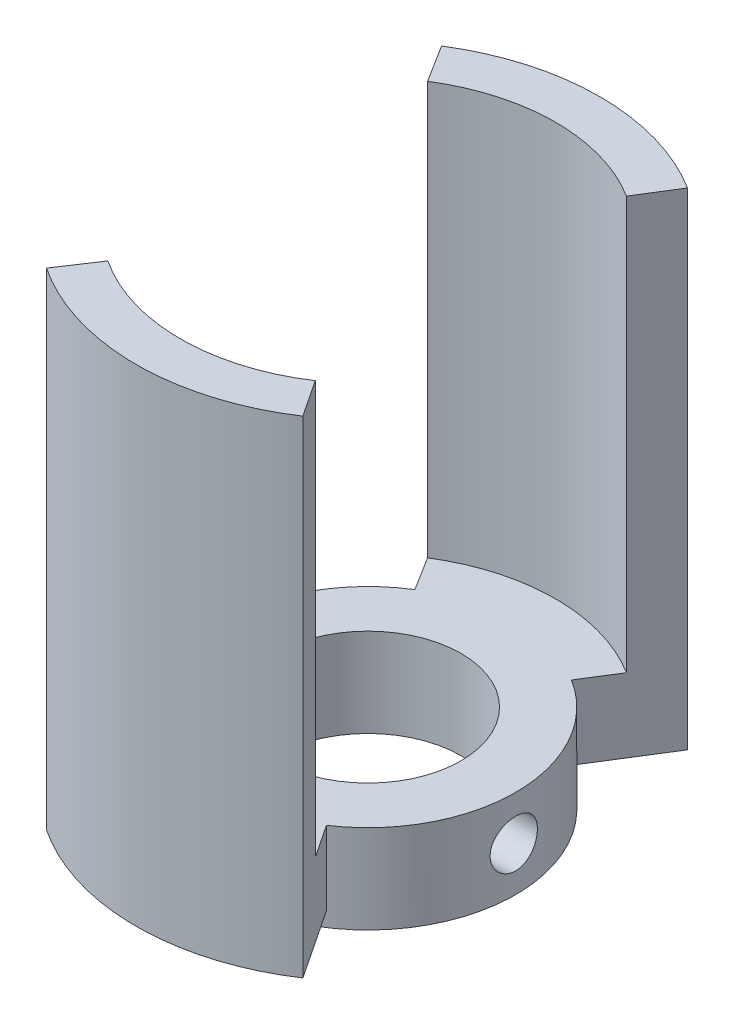
ISO-10303-21;
HEADER;
FILE_DESCRIPTION(('STEP AP214'),'2;1');
FILE_NAME('part.step','',(''),(''),'','','');
FILE_SCHEMA(('AUTOMOTIVE_DESIGN { 1 0 10303 214 1 1 1 1 }'));
ENDSEC;
DATA;
#1=APPLICATION_CONTEXT('core data for automotive mechanical design processes');
#2=APPLICATION_PROTOCOL_DEFINITION('international standard','automotive_design',2000,#1);
#3=PRODUCT_CONTEXT('',#1,'mechanical');
#4=PRODUCT('Part','Part','',(#3));
#5=PRODUCT_RELATED_PRODUCT_CATEGORY('part','',(#4));
#6=PRODUCT_DEFINITION_FORMATION('','',#4);
#7=PRODUCT_DEFINITION_CONTEXT('part definition',#1,'design');
#8=PRODUCT_DEFINITION('design','',#6,#7);
#9=PRODUCT_DEFINITION_SHAPE('','',#8);
#10=(LENGTH_UNIT() NAMED_UNIT(*) SI_UNIT(.MILLI.,.METRE.));
#11=(NAMED_UNIT(*) PLANE_ANGLE_UNIT() SI_UNIT($,.RADIAN.));
#12=(NAMED_UNIT(*) SI_UNIT($,.STERADIAN.) SOLID_ANGLE_UNIT());
#13=UNCERTAINTY_MEASURE_WITH_UNIT(LENGTH_MEASURE(1.E-05),#10,'distance_accuracy_value','');
#14=(GEOMETRIC_REPRESENTATION_CONTEXT(3) GLOBAL_UNCERTAINTY_ASSIGNED_CONTEXT((#13)) GLOBAL_UNIT_ASSIGNED_CONTEXT((#10,
#11,#12)) REPRESENTATION_CONTEXT('',''));
#15=CARTESIAN_POINT('',(0.,0.,0.));
#16=DIRECTION('',(0.,0.,1.));
#17=DIRECTION('',(1.,0.,0.));
#18=AXIS2_PLACEMENT_3D('',#15,#16,#17);
#19=CARTESIAN_POINT('',(-5.,0.,0.));
#20=DIRECTION('',(0.,1.,0.));
#21=DIRECTION('',(0.,0.,1.));
#22=AXIS2_PLACEMENT_3D('',#19,#20,#21);
#23=PLANE('',#22);
#24=CARTESIAN_POINT('',(0.,0.,0.));
#25=DIRECTION('',(0.,1.,0.));
#26=DIRECTION('',(0.,0.,1.));
#27=AXIS2_PLACEMENT_3D('',#24,#25,#26);
#28=CIRCLE('',#27,3.15);
#29=CARTESIAN_POINT('',(0.,0.,3.15));
#30=VERTEX_POINT('',#29);
#31=EDGE_CURVE('E291',#30,#30,#28,.T.);
#32=ORIENTED_EDGE('',*,*,#31,.F.);
#33=EDGE_LOOP('',(#32));
#34=FACE_BOUND('',#33,.T.);
#35=DIRECTION('',(0.55269750220772,0.,-0.833381947880651));
#36=VECTOR('',#35,1.);
#37=CARTESIAN_POINT('',(-4.33867539233068,0.,6.54204829086304));
#38=LINE('',#37,#36);
#39=CARTESIAN_POINT('',(-3.5096291390191,0.,5.29197536904208));
#40=VERTEX_POINT('',#39);
#41=CARTESIAN_POINT('',(-2.76348751103868,0.,4.1669097394032));
#42=VERTEX_POINT('',#41);
#43=EDGE_CURVE('E161',#40,#42,#38,.T.);
#44=ORIENTED_EDGE('',*,*,#43,.F.);
#45=CARTESIAN_POINT('',(0.,0.,0.));
#46=DIRECTION('',(0.,-1.,0.));
#47=DIRECTION('',(0.,0.,1.));
#48=AXIS2_PLACEMENT_3D('',#45,#46,#47);
#49=CIRCLE('',#48,6.35);
#50=CARTESIAN_POINT('',(3.50962913901908,0.,5.29197536904209));
#51=VERTEX_POINT('',#50);
#52=EDGE_CURVE('E151',#51,#40,#49,.T.);
#53=ORIENTED_EDGE('',*,*,#52,.F.);
#54=DIRECTION('',(0.55269750220773,0.,0.833381947880644));
#55=VECTOR('',#54,1.);
#56=CARTESIAN_POINT('',(2.76348751103865,0.,4.16690973940323));
#57=LINE('',#56,#55);
#58=CARTESIAN_POINT('',(2.76348751103864,0.,4.16690973940322));
#59=VERTEX_POINT('',#58);
#60=EDGE_CURVE('E51',#59,#51,#57,.T.);
#61=ORIENTED_EDGE('',*,*,#60,.F.);
#62=CARTESIAN_POINT('',(0.,0.,0.));
#63=DIRECTION('',(0.,1.,0.));
#64=DIRECTION('',(0.,0.,1.));
#65=AXIS2_PLACEMENT_3D('',#62,#63,#64);
#66=CIRCLE('',#65,5.);
#67=CARTESIAN_POINT('',(2.65064923820455,0.,-4.23958236339449));
#68=VERTEX_POINT('',#67);
#69=EDGE_CURVE('E302',#59,#68,#66,.T.);
#70=ORIENTED_EDGE('',*,*,#69,.T.);
#71=DIRECTION('',(-0.53012984764091,0.,0.847916472678899));
#72=VECTOR('',#71,1.);
#73=CARTESIAN_POINT('',(4.16151930398115,0.,-6.65614431052935));
#74=LINE('',#73,#72);
#75=CARTESIAN_POINT('',(3.36632453251978,0.,-5.38426960151101));
#76=VERTEX_POINT('',#75);
#77=EDGE_CURVE('E193',#76,#68,#74,.T.);
#78=ORIENTED_EDGE('',*,*,#77,.F.);
#79=CARTESIAN_POINT('',(0.,0.,0.));
#80=DIRECTION('',(0.,-1.,0.));
#81=DIRECTION('',(0.,0.,1.));
#82=AXIS2_PLACEMENT_3D('',#79,#80,#81);
#83=CIRCLE('',#82,6.35);
#84=CARTESIAN_POINT('',(-3.36632453251978,0.,-5.38426960151101));
#85=VERTEX_POINT('',#84);
#86=EDGE_CURVE('E58',#85,#76,#83,.T.);
#87=ORIENTED_EDGE('',*,*,#86,.F.);
#88=DIRECTION('',(-0.53012984764091,0.,-0.847916472678899));
#89=VECTOR('',#88,1.);
#90=CARTESIAN_POINT('',(-2.65064923820455,0.,-4.23958236339449));
#91=LINE('',#90,#89);
#92=CARTESIAN_POINT('',(-2.65064923820455,0.,-4.23958236339449));
#93=VERTEX_POINT('',#92);
#94=EDGE_CURVE('E198',#93,#85,#91,.T.);
#95=ORIENTED_EDGE('',*,*,#94,.F.);
#96=EDGE_CURVE('E44',#93,#42,#66,.T.);
#97=ORIENTED_EDGE('',*,*,#96,.T.);
#98=EDGE_LOOP('',(#44,#53,#61,#70,#78,#87,#95,#97));
#99=FACE_BOUND('',#98,.T.);
#100=ADVANCED_FACE('F37',(#34,#99),#23,.T.);
#101=CARTESIAN_POINT('',(0.,5.88818210542641,0.));
#102=DIRECTION('',(0.,1.,0.));
#103=DIRECTION('',(0.,0.,1.));
#104=AXIS2_PLACEMENT_3D('',#101,#102,#103);
#105=CYLINDRICAL_SURFACE('',#104,5.);
#106=CARTESIAN_POINT('',(4.93558507170123,-1.5,-0.799999999999994));
#107=CARTESIAN_POINT('',(4.93558585473547,-1.4553733138568,-0.799998185073409));
#108=CARTESIAN_POINT('',(4.93619688733532,-1.41072162366317,-0.796253222084032));
#109=CARTESIAN_POINT('',(4.93857300521684,-1.32266926107482,-0.781377782006159));
#110=CARTESIAN_POINT('',(4.94033918004371,-1.27926981020067,-0.770240332080269));
#111=CARTESIAN_POINT('',(4.94482054000624,-1.19500907475503,-0.740923891747522));
#112=CARTESIAN_POINT('',(4.94753495860065,-1.1541457713407,-0.72275058770329));
#113=CARTESIAN_POINT('',(4.95360605163724,-1.07605340784582,-0.679892166593979));
#114=CARTESIAN_POINT('',(4.95696264715696,-1.03882390202597,-0.655207849580235));
#115=CARTESIAN_POINT('',(4.96397400342678,-0.968712426881564,-0.599788560945842));
#116=CARTESIAN_POINT('',(4.96763096787548,-0.935868293795989,-0.569005994830315));
#117=CARTESIAN_POINT('',(4.97481140064582,-0.875788216136039,-0.502366839260941));
#118=CARTESIAN_POINT('',(4.97833486128557,-0.848552593879727,-0.466509958388676));
#119=CARTESIAN_POINT('',(4.98487450432198,-0.800321615483304,-0.390495966811719));
#120=CARTESIAN_POINT('',(4.98788779685136,-0.779361323864757,-0.350316337789534));
#121=CARTESIAN_POINT('',(4.99304311049062,-0.744501224376021,-0.266950398356383));
#122=CARTESIAN_POINT('',(4.99518518385959,-0.730600993003736,-0.223764268468985));
#123=CARTESIAN_POINT('',(4.99834115266823,-0.710370902255032,-0.136001651578425));
#124=CARTESIAN_POINT('',(4.99936450470397,-0.703977552237963,-0.0914401453437619));
#125=CARTESIAN_POINT('',(5.00020018470641,-0.698745396765724,-0.0018659230089008));
#126=CARTESIAN_POINT('',(5.00001258881248,-0.699906116342033,0.0431467645452038));
#127=CARTESIAN_POINT('',(4.99845502458808,-0.709699394274016,0.131911886391411));
#128=CARTESIAN_POINT('',(4.99709586763407,-0.718263633698933,0.175672074928564));
#129=CARTESIAN_POINT('',(4.99335994390295,-0.742513405849864,0.261126137099067));
#130=CARTESIAN_POINT('',(4.99098314806818,-0.758199141923771,0.30281995169127));
#131=CARTESIAN_POINT('',(4.98546052013802,-0.796315383480049,0.383162394563613));
#132=CARTESIAN_POINT('',(4.98231146029854,-0.81877429095833,0.421797317397531));
#133=CARTESIAN_POINT('',(4.97559462459779,-0.869778571446803,0.494775868628128));
#134=CARTESIAN_POINT('',(4.97202681745693,-0.898324399268316,0.529119176053382));
#135=CARTESIAN_POINT('',(4.96482262808635,-0.961071825424101,0.592942886294138));
#136=CARTESIAN_POINT('',(4.96118592518751,-0.995333110336364,0.622364603286394));
#137=CARTESIAN_POINT('',(4.95429255402911,-1.06833710250877,0.675050723309758));
#138=CARTESIAN_POINT('',(4.95103588876406,-1.10707984507577,0.69831507782578));
#139=CARTESIAN_POINT('',(4.94527126199405,-1.18801220398281,0.738036126509164));
#140=CARTESIAN_POINT('',(4.94276403130194,-1.23020513406254,0.754486181687668));
#141=CARTESIAN_POINT('',(4.93879457567579,-1.31680424865733,0.780049416047773));
#142=CARTESIAN_POINT('',(4.93733226635919,-1.36121025414573,0.789163187678036));
#143=CARTESIAN_POINT('',(4.93563441966908,-1.45045112906939,0.799713399990509));
#144=CARTESIAN_POINT('',(4.9353855460576,-1.49527588587375,0.801233305499676));
#145=CARTESIAN_POINT('',(4.93610727492225,-1.58453958650626,0.796774670192975));
#146=CARTESIAN_POINT('',(4.93707783413686,-1.628978543965,0.790796395388179));
#147=CARTESIAN_POINT('',(4.94011677879918,-1.71594676217776,0.771582110819437));
#148=CARTESIAN_POINT('',(4.94217879200386,-1.75848556927231,0.758388213376957));
#149=CARTESIAN_POINT('',(4.94716299895284,-1.84074815480667,0.725161227645418));
#150=CARTESIAN_POINT('',(4.95008524049443,-1.88047177667274,0.705127759316014));
#151=CARTESIAN_POINT('',(4.95649180721203,-1.95634895723258,0.658591860869643));
#152=CARTESIAN_POINT('',(4.95998071331545,-1.99246918142802,0.632035720375417));
#153=CARTESIAN_POINT('',(4.96711393660611,-2.05977042425469,0.573282416990775));
#154=CARTESIAN_POINT('',(4.97075826382481,-2.09095112345601,0.541084889565661));
#155=CARTESIAN_POINT('',(4.97783368328296,-2.14779091683714,0.471593901952483));
#156=CARTESIAN_POINT('',(4.98126240933245,-2.17339449164431,0.434254752917194));
#157=CARTESIAN_POINT('',(4.98748283986874,-2.21796521839539,0.35575673895542));
#158=CARTESIAN_POINT('',(4.9902745636858,-2.23693257172911,0.314597989990528));
#159=CARTESIAN_POINT('',(4.99489611998972,-2.26760508960747,0.229797510837734));
#160=CARTESIAN_POINT('',(4.99672986677083,-2.27933984249439,0.186166705239429));
#161=CARTESIAN_POINT('',(4.99924535633416,-2.295309534557,0.0975221020879297));
#162=CARTESIAN_POINT('',(4.99992718616821,-2.2995450404616,0.0525084093030925));
#163=CARTESIAN_POINT('',(5.00006093539052,-2.3003807192317,-0.0370872642982859));
#164=CARTESIAN_POINT('',(4.9995264932218,-2.29706555976115,-0.0816684579131941));
#165=CARTESIAN_POINT('',(4.99731544898762,-2.28307646469126,-0.169630532454884));
#166=CARTESIAN_POINT('',(4.99563885213226,-2.27240256265979,-0.213011418856085));
#167=CARTESIAN_POINT('',(4.9913311157785,-2.24403047006883,-0.297312849245192));
#168=CARTESIAN_POINT('',(4.98870088038931,-2.22633893118065,-0.338235680929927));
#169=CARTESIAN_POINT('',(4.98277371983535,-2.18444301584854,-0.416545279322136));
#170=CARTESIAN_POINT('',(4.9794767671163,-2.16023837021556,-0.453931899790391));
#171=CARTESIAN_POINT('',(4.9725381855774,-2.1057006718458,-0.524535556587544));
#172=CARTESIAN_POINT('',(4.96889327467274,-2.07530539880372,-0.557704213276182));
#173=CARTESIAN_POINT('',(4.96169293810507,-2.0093800524562,-0.618500476330203));
#174=CARTESIAN_POINT('',(4.95813753360885,-1.97384877771776,-0.646126782587249));
#175=CARTESIAN_POINT('',(4.95149402021015,-1.89838833042705,-0.695216766947152));
#176=CARTESIAN_POINT('',(4.94840907975937,-1.85843221987585,-0.716639464440317));
#177=CARTESIAN_POINT('',(4.94309308858453,-1.7754566841129,-0.752436729569794));
#178=CARTESIAN_POINT('',(4.94086117163203,-1.73244041937774,-0.766818451370858));
#179=CARTESIAN_POINT('',(4.93800748018891,-1.65770481675488,-0.784943942649531));
#180=CARTESIAN_POINT('',(4.93710403046998,-1.62644188261262,-0.790581080454425));
#181=CARTESIAN_POINT('',(4.93589255254275,-1.56345684217454,-0.798109724682122));
#182=CARTESIAN_POINT('',(4.93558451487318,-1.53173474318303,-0.800001290623028));
#183=CARTESIAN_POINT('',(4.93558507170123,-1.5,-0.799999999999994));
#184=B_SPLINE_CURVE_WITH_KNOTS('',3,(#106,#107,#108,#109,#110,#111,#112,#113,#114,#115,#116,
#117,#118,#119,#120,#121,#122,#123,#124,#125,#126,#127,#128,#129,#130,#131,#132,#133,#134,#135,
#136,#137,#138,#139,#140,#141,#142,#143,#144,#145,#146,#147,#148,#149,#150,#151,#152,#153,#154,
#155,#156,#157,#158,#159,#160,#161,#162,#163,#164,#165,#166,#167,#168,#169,#170,#171,#172,#173,
#174,#175,#176,#177,#178,#179,#180,#181,#182,#183),.UNSPECIFIED.,.T.,.F.,(4,2,2,2,2,2,2,2,2,2,2,
2,2,2,2,2,2,2,2,2,2,2,2,2,2,2,2,2,2,2,2,2,2,2,2,2,2,2,4),(0.,0.133764032978236,
0.267654416240314,0.401436814708976,0.535202782098974,0.670057077330418,0.804919120403261,
0.940521238000373,1.07611522045935,1.21055394043863,1.34498420755127,1.47818704938262,
1.61139369493981,1.74516687269945,1.87895004942163,2.01422953733833,2.14951009111739,
2.28492213686846,2.42032324619165,2.5542328253214,2.68813765390883,2.82126919083115,
2.95440812640359,3.08868247170644,3.22296549674046,3.35852970160141,3.49408979213058,
3.62909156425648,3.7640831336681,3.89756846817798,4.03105319378105,4.16441169698708,
4.29777571279491,4.4325528842427,4.56736163445242,4.70304160363668,4.83858342408623,
4.93370665764443,5.02882837965776),.UNSPECIFIED.);
#185=CARTESIAN_POINT('',(4.93558507170123,-1.5,-0.799999999999994));
#186=VERTEX_POINT('',#185);
#187=EDGE_CURVE('E224',#186,#186,#184,.T.);
#188=ORIENTED_EDGE('',*,*,#187,.F.);
#189=EDGE_LOOP('',(#188));
#190=FACE_BOUND('',#189,.T.);
#191=CARTESIAN_POINT('',(0.,-3.,0.));
#192=DIRECTION('',(0.,1.,0.));
#193=DIRECTION('',(0.,0.,1.));
#194=AXIS2_PLACEMENT_3D('',#191,#192,#193);
#195=CIRCLE('',#194,5.);
#196=CARTESIAN_POINT('',(0.,-3.,5.));
#197=VERTEX_POINT('',#196);
#198=EDGE_CURVE('E11',#197,#197,#195,.T.);
#199=ORIENTED_EDGE('',*,*,#198,.T.);
#200=EDGE_LOOP('',(#199));
#201=FACE_BOUND('',#200,.T.);
#202=CARTESIAN_POINT('',(0.,-2.5,0.));
#203=DIRECTION('',(0.,1.,0.));
#204=DIRECTION('',(0.,0.,-1.));
#205=AXIS2_PLACEMENT_3D('',#202,#203,#204);
#206=CIRCLE('',#205,5.);
#207=CARTESIAN_POINT('',(-2.76348751103868,-2.5,4.1669097394032));
#208=VERTEX_POINT('',#207);
#209=CARTESIAN_POINT('',(2.76348751103865,-2.5,4.16690973940323));
#210=VERTEX_POINT('',#209);
#211=EDGE_CURVE('E165',#208,#210,#206,.T.);
#212=ORIENTED_EDGE('',*,*,#211,.F.);
#213=DIRECTION('',(0.,1.,0.));
#214=VECTOR('',#213,1.);
#215=CARTESIAN_POINT('',(-2.76348751103868,-2.5,4.1669097394032));
#216=LINE('',#215,#214);
#217=EDGE_CURVE('E171',#208,#42,#216,.T.);
#218=ORIENTED_EDGE('',*,*,#217,.T.);
#219=ORIENTED_EDGE('',*,*,#96,.F.);
#220=DIRECTION('',(0.,1.,0.));
#221=VECTOR('',#220,1.);
#222=CARTESIAN_POINT('',(-2.65064923820455,-2.5,-4.23958236339449));
#223=LINE('',#222,#221);
#224=CARTESIAN_POINT('',(-2.65064923820455,-2.5,-4.23958236339449));
#225=VERTEX_POINT('',#224);
#226=EDGE_CURVE('E209',#225,#93,#223,.T.);
#227=ORIENTED_EDGE('',*,*,#226,.F.);
#228=CARTESIAN_POINT('',(0.,-2.5,0.));
#229=DIRECTION('',(0.,1.,0.));
#230=DIRECTION('',(0.,0.,-1.));
#231=AXIS2_PLACEMENT_3D('',#228,#229,#230);
#232=CIRCLE('',#231,5.);
#233=CARTESIAN_POINT('',(2.65064923820455,-2.5,-4.23958236339449));
#234=VERTEX_POINT('',#233);
#235=EDGE_CURVE('E200',#234,#225,#232,.T.);
#236=ORIENTED_EDGE('',*,*,#235,.F.);
#237=DIRECTION('',(0.,1.,0.));
#238=VECTOR('',#237,1.);
#239=CARTESIAN_POINT('',(2.65064923820455,-2.5,-4.23958236339449));
#240=LINE('',#239,#238);
#241=EDGE_CURVE('E212',#234,#68,#240,.T.);
#242=ORIENTED_EDGE('',*,*,#241,.T.);
#243=ORIENTED_EDGE('',*,*,#69,.F.);
#244=DIRECTION('',(0.,1.,0.));
#245=VECTOR('',#244,1.);
#246=CARTESIAN_POINT('',(2.76348751103865,-2.5,4.16690973940323));
#247=LINE('',#246,#245);
#248=EDGE_CURVE('E136',#210,#59,#247,.T.);
#249=ORIENTED_EDGE('',*,*,#248,.F.);
#250=EDGE_LOOP('',(#212,#218,#219,#227,#236,#242,#243,#249));
#251=FACE_BOUND('',#250,.T.);
#252=ADVANCED_FACE('F282',(#190,#201,#251),#105,.T.);
#253=CARTESIAN_POINT('',(-5.,-3.,0.));
#254=DIRECTION('',(0.,-1.,0.));
#255=DIRECTION('',(0.,0.,-1.));
#256=AXIS2_PLACEMENT_3D('',#253,#254,#255);
#257=PLANE('',#256);
#258=CARTESIAN_POINT('',(0.,-3.,0.));
#259=DIRECTION('',(0.,1.,0.));
#260=DIRECTION('',(0.,0.,1.));
#261=AXIS2_PLACEMENT_3D('',#258,#259,#260);
#262=CIRCLE('',#261,3.15);
#263=CARTESIAN_POINT('',(0.,-3.,3.15));
#264=VERTEX_POINT('',#263);
#265=EDGE_CURVE('E305',#264,#264,#262,.T.);
#266=ORIENTED_EDGE('',*,*,#265,.T.);
#267=EDGE_LOOP('',(#266));
#268=FACE_BOUND('',#267,.T.);
#269=ORIENTED_EDGE('',*,*,#198,.F.);
#270=EDGE_LOOP('',(#269));
#271=FACE_BOUND('',#270,.T.);
#272=ADVANCED_FACE('F287',(#268,#271),#257,.T.);
#273=CARTESIAN_POINT('',(0.,-3.,0.));
#274=DIRECTION('',(0.,1.,0.));
#275=DIRECTION('',(0.,0.,1.));
#276=AXIS2_PLACEMENT_3D('',#273,#274,#275);
#277=CYLINDRICAL_SURFACE('',#276,3.15);
#278=CARTESIAN_POINT('',(3.04671954731643,-1.5,-0.799999999999994));
#279=CARTESIAN_POINT('',(3.04672037562088,-1.45584831992858,-0.799998787491232));
#280=CARTESIAN_POINT('',(3.04768977046248,-1.41168336372897,-0.796332478856327));
#281=CARTESIAN_POINT('',(3.05145231147786,-1.32462340259968,-0.781788518001451));
#282=CARTESIAN_POINT('',(3.05424648470091,-1.28172912707473,-0.770906804645788));
#283=CARTESIAN_POINT('',(3.06132217525296,-1.19848242249005,-0.742308305649663));
#284=CARTESIAN_POINT('',(3.06560173214644,-1.15812672548843,-0.724600525781015));
#285=CARTESIAN_POINT('',(3.07516353708976,-1.08095403317907,-0.682880169734236));
#286=CARTESIAN_POINT('',(3.08044583603438,-1.04413721763238,-0.658867273512338));
#287=CARTESIAN_POINT('',(3.09155223041649,-0.97425150673387,-0.604635833440505));
#288=CARTESIAN_POINT('',(3.09738520663052,-0.941274816388711,-0.574300264191975));
#289=CARTESIAN_POINT('',(3.10885877769155,-0.880818399137855,-0.508536568917144));
#290=CARTESIAN_POINT('',(3.11449935406675,-0.853339198806485,-0.473107955614191));
#291=CARTESIAN_POINT('',(3.12505103772182,-0.804278866130022,-0.397530396505204));
#292=CARTESIAN_POINT('',(3.12995044392561,-0.782788567223715,-0.357320712058883));
#293=CARTESIAN_POINT('',(3.13836630541931,-0.746907087038949,-0.273714256198096));
#294=CARTESIAN_POINT('',(3.1418829714787,-0.732514823730032,-0.230317971711088));
#295=CARTESIAN_POINT('',(3.14707433539005,-0.711534011221934,-0.142531701820605));
#296=CARTESIAN_POINT('',(3.14878595459454,-0.704788819636219,-0.0981813750153104));
#297=CARTESIAN_POINT('',(3.15030313322582,-0.698801666454749,-0.00894781846071554));
#298=CARTESIAN_POINT('',(3.150108983113,-0.699558561457948,0.0359353290393383));
#299=CARTESIAN_POINT('',(3.14786388222345,-0.708441982559227,0.123873150955545));
#300=CARTESIAN_POINT('',(3.14585554271486,-0.716399391953658,0.166946161605962));
#301=CARTESIAN_POINT('',(3.1402574919405,-0.739185804904947,0.251124305993878));
#302=CARTESIAN_POINT('',(3.13666769501371,-0.754015180690181,0.292229333000075));
#303=CARTESIAN_POINT('',(3.12824535898402,-0.79025971594598,0.371747015245165));
#304=CARTESIAN_POINT('',(3.12340162952679,-0.811734536565526,0.410131242711211));
#305=CARTESIAN_POINT('',(3.11299603080796,-0.860614990966019,0.482810089750206));
#306=CARTESIAN_POINT('',(3.107434033124,-0.888021685926844,0.517103975878619));
#307=CARTESIAN_POINT('',(3.09601405024654,-0.948892464417763,0.581637476849313));
#308=CARTESIAN_POINT('',(3.09015213668696,-0.982504269014047,0.611737212204872));
#309=CARTESIAN_POINT('',(3.07893459013064,-1.05435968543896,0.665904739897344));
#310=CARTESIAN_POINT('',(3.07357898238748,-1.09260352808812,0.689972231456058));
#311=CARTESIAN_POINT('',(3.06396595614438,-1.17291850349833,0.731485527959731));
#312=CARTESIAN_POINT('',(3.05971432517762,-1.21500830215592,0.748896653556091));
#313=CARTESIAN_POINT('',(3.05286429526141,-1.30165187295297,0.776351724296638));
#314=CARTESIAN_POINT('',(3.05026552965418,-1.34620509624175,0.786397303427492));
#315=CARTESIAN_POINT('',(3.04709270125328,-1.43521103325889,0.79860194445219));
#316=CARTESIAN_POINT('',(3.04646544638303,-1.47963346573185,0.800968254421254));
#317=CARTESIAN_POINT('',(3.04716169633487,-1.56823870789063,0.798315414932798));
#318=CARTESIAN_POINT('',(3.04848501516182,-1.61242154002013,0.793296969641834));
#319=CARTESIAN_POINT('',(3.05288224097786,-1.69851712971965,0.776199028048116));
#320=CARTESIAN_POINT('',(3.05592598509977,-1.74045571844924,0.764241102221881));
#321=CARTESIAN_POINT('',(3.06339227746886,-1.82173285910573,0.733738872080799));
#322=CARTESIAN_POINT('',(3.06781499303056,-1.86107109482206,0.715193768486928));
#323=CARTESIAN_POINT('',(3.07765223610146,-1.93690641571195,0.671612872592892));
#324=CARTESIAN_POINT('',(3.08308497232224,-1.97333017378177,0.646453685524546));
#325=CARTESIAN_POINT('',(3.09428588292921,-2.04151497878941,0.590514105694039));
#326=CARTESIAN_POINT('',(3.10005411416964,-2.07327523219913,0.559732758276661));
#327=CARTESIAN_POINT('',(3.1114570173882,-2.13207582550782,0.492469744445852));
#328=CARTESIAN_POINT('',(3.11708435475773,-2.15897252569249,0.455861030897153));
#329=CARTESIAN_POINT('',(3.12741700181015,-2.20623705219499,0.378526653870691));
#330=CARTESIAN_POINT('',(3.13212235994353,-2.22660522162627,0.337801206899975));
#331=CARTESIAN_POINT('',(3.14005099930513,-2.26005500980664,0.253672778818782));
#332=CARTESIAN_POINT('',(3.14328502472949,-2.27318960425132,0.210291921723112));
#333=CARTESIAN_POINT('',(3.14795371059435,-2.29195729751027,0.121845363558598));
#334=CARTESIAN_POINT('',(3.14938873017106,-2.29759189356591,0.0767800006187531));
#335=CARTESIAN_POINT('',(3.15028252080941,-2.30111317588415,-0.0124086801143127));
#336=CARTESIAN_POINT('',(3.1497952849568,-2.29921153611713,-0.0565232241986996));
#337=CARTESIAN_POINT('',(3.14701959516578,-2.28820070853938,-0.143782456005577));
#338=CARTESIAN_POINT('',(3.14473119796158,-2.27909174774974,-0.186927174232278));
#339=CARTESIAN_POINT('',(3.1386192227224,-2.25403986046255,-0.270792749677217));
#340=CARTESIAN_POINT('',(3.13480449671293,-2.23813630414253,-0.311526054708036));
#341=CARTESIAN_POINT('',(3.12604088416692,-2.19998221759256,-0.389769259415511));
#342=CARTESIAN_POINT('',(3.12109185072981,-2.17773086518824,-0.427278740719081));
#343=CARTESIAN_POINT('',(3.11044020828261,-2.12687332604076,-0.499009036121088));
#344=CARTESIAN_POINT('',(3.10472205617256,-2.09812427499131,-0.533126248782787));
#345=CARTESIAN_POINT('',(3.09324487456525,-2.03536329597628,-0.596123912464205));
#346=CARTESIAN_POINT('',(3.08748583499281,-2.00135002463133,-0.625003022672402));
#347=CARTESIAN_POINT('',(3.07645128983346,-1.92823121847673,-0.677256343279082));
#348=CARTESIAN_POINT('',(3.07118734386755,-1.88903963316484,-0.700512781076032));
#349=CARTESIAN_POINT('',(3.06189623834876,-1.80717457495404,-0.740072440308267));
#350=CARTESIAN_POINT('',(3.05786820031328,-1.76450360263631,-0.756380603791757));
#351=CARTESIAN_POINT('',(3.05211833149557,-1.68493838785163,-0.779220505535315));
#352=CARTESIAN_POINT('',(3.05010928406368,-1.64841690805514,-0.786995531950328));
#353=CARTESIAN_POINT('',(3.04740960233127,-1.57460006403489,-0.797385555480301));
#354=CARTESIAN_POINT('',(3.04671884746293,-1.53730477089763,-0.800001024476559));
#355=CARTESIAN_POINT('',(3.04671954731643,-1.5,-0.799999999999994));
#356=B_SPLINE_CURVE_WITH_KNOTS('',3,(#278,#279,#280,#281,#282,#283,#284,#285,#286,#287,#288,
#289,#290,#291,#292,#293,#294,#295,#296,#297,#298,#299,#300,#301,#302,#303,#304,#305,#306,#307,
#308,#309,#310,#311,#312,#313,#314,#315,#316,#317,#318,#319,#320,#321,#322,#323,#324,#325,#326,
#327,#328,#329,#330,#331,#332,#333,#334,#335,#336,#337,#338,#339,#340,#341,#342,#343,#344,#345,
#346,#347,#348,#349,#350,#351,#352,#353,#354,#355),.UNSPECIFIED.,.T.,.F.,(4,2,2,2,2,2,2,2,2,2,2,
2,2,2,2,2,2,2,2,2,2,2,2,2,2,2,2,2,2,2,2,2,2,2,2,2,2,2,4),(0.,0.132318004328744,
0.264710546128431,0.396929014210455,0.529154194917143,0.664087485925241,0.799033695269598,
0.935927228108652,1.07279988632832,1.20681510912295,1.34080990682816,1.47173703389584,
1.60267125361889,1.73481685320754,1.86698611248956,2.00284445787236,2.13870957604224,
2.27527319966463,2.41180651858235,2.54462302607884,2.67742686979991,2.80797153721006,
2.93853205014344,3.07172647474599,3.20494353711699,3.34161278102701,3.47827484097059,
3.61392226404176,3.74954260345277,3.88138108182068,4.01321540761625,4.14429598569532,
4.27539354920659,4.40971613795174,4.5440730612461,4.68103871106558,4.81790677903832,
4.9297155332035,5.04151406112203),.UNSPECIFIED.);
#357=CARTESIAN_POINT('',(3.04671954731643,-1.5,-0.799999999999994));
#358=VERTEX_POINT('',#357);
#359=EDGE_CURVE('E217',#358,#358,#356,.T.);
#360=ORIENTED_EDGE('',*,*,#359,.T.);
#361=EDGE_LOOP('',(#360));
#362=FACE_BOUND('',#361,.T.);
#363=ORIENTED_EDGE('',*,*,#265,.F.);
#364=EDGE_LOOP('',(#363));
#365=FACE_BOUND('',#364,.T.);
#366=ORIENTED_EDGE('',*,*,#31,.T.);
#367=EDGE_LOOP('',(#366));
#368=FACE_BOUND('',#367,.T.);
#369=ADVANCED_FACE('F236',(#362,#365,#368),#277,.F.);
#370=CARTESIAN_POINT('',(5.,-1.5,0.));
#371=DIRECTION('',(1.,0.,0.));
#372=DIRECTION('',(0.,0.,-1.));
#373=AXIS2_PLACEMENT_3D('',#370,#371,#372);
#374=CYLINDRICAL_SURFACE('',#373,0.799999999999994);
#375=ORIENTED_EDGE('',*,*,#187,.T.);
#376=EDGE_LOOP('',(#375));
#377=FACE_BOUND('',#376,.T.);
#378=ORIENTED_EDGE('',*,*,#359,.F.);
#379=EDGE_LOOP('',(#378));
#380=FACE_BOUND('',#379,.T.);
#381=ADVANCED_FACE('F231',(#377,#380),#374,.F.);
#382=CARTESIAN_POINT('',(0.,-2.5,0.));
#383=DIRECTION('',(0.,1.,0.));
#384=DIRECTION('',(0.,0.,1.));
#385=AXIS2_PLACEMENT_3D('',#382,#383,#384);
#386=CYLINDRICAL_SURFACE('',#385,7.85);
#387=DIRECTION('',(0.,1.,0.));
#388=VECTOR('',#387,1.);
#389=CARTESIAN_POINT('',(-4.16151930398114,-2.5,-6.65614431052935));
#390=LINE('',#389,#388);
#391=CARTESIAN_POINT('',(-4.16151930398114,-2.5,-6.65614431052935));
#392=VERTEX_POINT('',#391);
#393=CARTESIAN_POINT('',(-4.16151930398114,13.97,-6.65614431052935));
#394=VERTEX_POINT('',#393);
#395=EDGE_CURVE('E204',#392,#394,#390,.T.);
#396=ORIENTED_EDGE('',*,*,#395,.T.);
#397=CARTESIAN_POINT('',(0.,13.97,0.));
#398=DIRECTION('',(0.,1.,0.));
#399=DIRECTION('',(0.,0.,1.));
#400=AXIS2_PLACEMENT_3D('',#397,#398,#399);
#401=CIRCLE('',#400,7.85);
#402=CARTESIAN_POINT('',(4.16151930398115,13.97,-6.65614431052935));
#403=VERTEX_POINT('',#402);
#404=EDGE_CURVE('E176',#403,#394,#401,.T.);
#405=ORIENTED_EDGE('',*,*,#404,.F.);
#406=DIRECTION('',(0.,1.,0.));
#407=VECTOR('',#406,1.);
#408=CARTESIAN_POINT('',(4.16151930398115,-2.5,-6.65614431052935));
#409=LINE('',#408,#407);
#410=CARTESIAN_POINT('',(4.16151930398115,-2.5,-6.65614431052935));
#411=VERTEX_POINT('',#410);
#412=EDGE_CURVE('E215',#411,#403,#409,.T.);
#413=ORIENTED_EDGE('',*,*,#412,.F.);
#414=CARTESIAN_POINT('',(0.,-2.5,0.));
#415=DIRECTION('',(0.,-1.,0.));
#416=DIRECTION('',(0.,0.,-1.));
#417=AXIS2_PLACEMENT_3D('',#414,#415,#416);
#418=CIRCLE('',#417,7.85);
#419=EDGE_CURVE('E194',#392,#411,#418,.T.);
#420=ORIENTED_EDGE('',*,*,#419,.F.);
#421=EDGE_LOOP('',(#396,#405,#413,#420));
#422=FACE_BOUND('',#421,.T.);
#423=ADVANCED_FACE('F235',(#422),#386,.T.);
#424=CARTESIAN_POINT('',(4.16151930398115,-2.5,-6.65614431052935));
#425=DIRECTION('',(-0.847916472678899,0.,-0.53012984764091));
#426=DIRECTION('',(-0.53012984764091,0.,0.847916472678899));
#427=AXIS2_PLACEMENT_3D('',#424,#425,#426);
#428=PLANE('',#427);
#429=ORIENTED_EDGE('',*,*,#412,.T.);
#430=DIRECTION('',(0.53012984764091,0.,-0.847916472678898));
#431=VECTOR('',#430,1.);
#432=CARTESIAN_POINT('',(3.36632453251978,13.97,-5.38426960151101));
#433=LINE('',#432,#431);
#434=CARTESIAN_POINT('',(3.36632453251978,13.97,-5.38426960151101));
#435=VERTEX_POINT('',#434);
#436=EDGE_CURVE('E183',#435,#403,#433,.T.);
#437=ORIENTED_EDGE('',*,*,#436,.F.);
#438=DIRECTION('',(0.,-1.,0.));
#439=VECTOR('',#438,1.);
#440=CARTESIAN_POINT('',(3.36632453251978,13.97,-5.38426960151101));
#441=LINE('',#440,#439);
#442=EDGE_CURVE('E186',#435,#76,#441,.T.);
#443=ORIENTED_EDGE('',*,*,#442,.T.);
#444=ORIENTED_EDGE('',*,*,#77,.T.);
#445=ORIENTED_EDGE('',*,*,#241,.F.);
#446=DIRECTION('',(-0.53012984764091,0.,0.847916472678899));
#447=VECTOR('',#446,1.);
#448=CARTESIAN_POINT('',(4.16151930398115,-2.5,-6.65614431052935));
#449=LINE('',#448,#447);
#450=EDGE_CURVE('E197',#411,#234,#449,.T.);
#451=ORIENTED_EDGE('',*,*,#450,.F.);
#452=EDGE_LOOP('',(#429,#437,#443,#444,#445,#451));
#453=FACE_BOUND('',#452,.T.);
#454=ADVANCED_FACE('F241',(#453),#428,.F.);
#455=CARTESIAN_POINT('',(-2.65064923820455,-2.5,-4.23958236339449));
#456=DIRECTION('',(0.847916472678899,0.,-0.53012984764091));
#457=DIRECTION('',(-0.53012984764091,0.,-0.847916472678899));
#458=AXIS2_PLACEMENT_3D('',#455,#456,#457);
#459=PLANE('',#458);
#460=ORIENTED_EDGE('',*,*,#94,.T.);
#461=DIRECTION('',(0.,-1.,0.));
#462=VECTOR('',#461,1.);
#463=CARTESIAN_POINT('',(-3.36632453251978,13.97,-5.38426960151101));
#464=LINE('',#463,#462);
#465=CARTESIAN_POINT('',(-3.36632453251978,13.97,-5.38426960151101));
#466=VERTEX_POINT('',#465);
#467=EDGE_CURVE('E190',#466,#85,#464,.T.);
#468=ORIENTED_EDGE('',*,*,#467,.F.);
#469=DIRECTION('',(0.53012984764091,0.,0.847916472678899));
#470=VECTOR('',#469,1.);
#471=CARTESIAN_POINT('',(-3.36632453251978,13.97,-5.38426960151101));
#472=LINE('',#471,#470);
#473=EDGE_CURVE('E179',#394,#466,#472,.T.);
#474=ORIENTED_EDGE('',*,*,#473,.F.);
#475=ORIENTED_EDGE('',*,*,#395,.F.);
#476=DIRECTION('',(-0.53012984764091,0.,-0.847916472678899));
#477=VECTOR('',#476,1.);
#478=CARTESIAN_POINT('',(-2.65064923820455,-2.5,-4.23958236339449));
#479=LINE('',#478,#477);
#480=EDGE_CURVE('E202',#225,#392,#479,.T.);
#481=ORIENTED_EDGE('',*,*,#480,.F.);
#482=ORIENTED_EDGE('',*,*,#226,.T.);
#483=EDGE_LOOP('',(#460,#468,#474,#475,#481,#482));
#484=FACE_BOUND('',#483,.T.);
#485=ADVANCED_FACE('F245',(#484),#459,.F.);
#486=CARTESIAN_POINT('',(0.,-2.5,0.));
#487=DIRECTION('',(0.,-1.,0.));
#488=DIRECTION('',(0.,0.,-1.));
#489=AXIS2_PLACEMENT_3D('',#486,#487,#488);
#490=PLANE('',#489);
#491=ORIENTED_EDGE('',*,*,#419,.T.);
#492=ORIENTED_EDGE('',*,*,#450,.T.);
#493=ORIENTED_EDGE('',*,*,#235,.T.);
#494=ORIENTED_EDGE('',*,*,#480,.T.);
#495=EDGE_LOOP('',(#491,#492,#493,#494));
#496=FACE_BOUND('',#495,.T.);
#497=ADVANCED_FACE('F249',(#496),#490,.T.);
#498=CARTESIAN_POINT('',(0.,13.97,0.));
#499=DIRECTION('',(0.,-1.,0.));
#500=DIRECTION('',(0.,0.,-1.));
#501=AXIS2_PLACEMENT_3D('',#498,#499,#500);
#502=CYLINDRICAL_SURFACE('',#501,6.35);
#503=ORIENTED_EDGE('',*,*,#86,.T.);
#504=ORIENTED_EDGE('',*,*,#442,.F.);
#505=CARTESIAN_POINT('',(0.,13.97,0.));
#506=DIRECTION('',(0.,-1.,0.));
#507=DIRECTION('',(0.,0.,1.));
#508=AXIS2_PLACEMENT_3D('',#505,#506,#507);
#509=CIRCLE('',#508,6.35);
#510=EDGE_CURVE('E181',#466,#435,#509,.T.);
#511=ORIENTED_EDGE('',*,*,#510,.F.);
#512=ORIENTED_EDGE('',*,*,#467,.T.);
#513=EDGE_LOOP('',(#503,#504,#511,#512));
#514=FACE_BOUND('',#513,.T.);
#515=ADVANCED_FACE('F253',(#514),#502,.F.);
#516=CARTESIAN_POINT('',(0.,13.97,0.));
#517=DIRECTION('',(0.,1.,0.));
#518=DIRECTION('',(0.,0.,1.));
#519=AXIS2_PLACEMENT_3D('',#516,#517,#518);
#520=PLANE('',#519);
#521=ORIENTED_EDGE('',*,*,#404,.T.);
#522=ORIENTED_EDGE('',*,*,#473,.T.);
#523=ORIENTED_EDGE('',*,*,#510,.T.);
#524=ORIENTED_EDGE('',*,*,#436,.T.);
#525=EDGE_LOOP('',(#521,#522,#523,#524));
#526=FACE_BOUND('',#525,.T.);
#527=ADVANCED_FACE('F257',(#526),#520,.T.);
#528=CARTESIAN_POINT('',(0.,-2.5,0.));
#529=DIRECTION('',(0.,1.,0.));
#530=DIRECTION('',(0.,0.,1.));
#531=AXIS2_PLACEMENT_3D('',#528,#529,#530);
#532=CYLINDRICAL_SURFACE('',#531,7.84999999999999);
#533=DIRECTION('',(0.,1.,0.));
#534=VECTOR('',#533,1.);
#535=CARTESIAN_POINT('',(4.33867539233068,-2.5,6.54204829086306));
#536=LINE('',#535,#534);
#537=CARTESIAN_POINT('',(4.33867539233068,-2.5,6.54204829086306));
#538=VERTEX_POINT('',#537);
#539=CARTESIAN_POINT('',(4.33867539233068,13.97,6.54204829086306));
#540=VERTEX_POINT('',#539);
#541=EDGE_CURVE('E126',#538,#540,#536,.T.);
#542=ORIENTED_EDGE('',*,*,#541,.T.);
#543=CARTESIAN_POINT('',(0.,13.97,0.));
#544=DIRECTION('',(0.,1.,0.));
#545=DIRECTION('',(0.,0.,1.));
#546=AXIS2_PLACEMENT_3D('',#543,#544,#545);
#547=CIRCLE('',#546,7.84999999999999);
#548=CARTESIAN_POINT('',(-4.33867539233068,13.97,6.54204829086304));
#549=VERTEX_POINT('',#548);
#550=EDGE_CURVE('E131',#549,#540,#547,.T.);
#551=ORIENTED_EDGE('',*,*,#550,.F.);
#552=DIRECTION('',(0.,1.,0.));
#553=VECTOR('',#552,1.);
#554=CARTESIAN_POINT('',(-4.33867539233068,-2.5,6.54204829086304));
#555=LINE('',#554,#553);
#556=CARTESIAN_POINT('',(-4.33867539233068,-2.5,6.54204829086304));
#557=VERTEX_POINT('',#556);
#558=EDGE_CURVE('E174',#557,#549,#555,.T.);
#559=ORIENTED_EDGE('',*,*,#558,.F.);
#560=CARTESIAN_POINT('',(0.,-2.5,0.));
#561=DIRECTION('',(0.,-1.,0.));
#562=DIRECTION('',(0.,0.,-1.));
#563=AXIS2_PLACEMENT_3D('',#560,#561,#562);
#564=CIRCLE('',#563,7.84999999999999);
#565=EDGE_CURVE('E133',#538,#557,#564,.T.);
#566=ORIENTED_EDGE('',*,*,#565,.F.);
#567=EDGE_LOOP('',(#542,#551,#559,#566));
#568=FACE_BOUND('',#567,.T.);
#569=ADVANCED_FACE('F128',(#568),#532,.T.);
#570=CARTESIAN_POINT('',(-4.33867539233068,-2.5,6.54204829086304));
#571=DIRECTION('',(0.833381947880651,0.,0.55269750220772));
#572=DIRECTION('',(0.55269750220772,0.,-0.833381947880651));
#573=AXIS2_PLACEMENT_3D('',#570,#571,#572);
#574=PLANE('',#573);
#575=ORIENTED_EDGE('',*,*,#558,.T.);
#576=DIRECTION('',(-0.55269750220772,0.,0.83338194788065));
#577=VECTOR('',#576,1.);
#578=CARTESIAN_POINT('',(-3.5096291390191,13.97,5.29197536904208));
#579=LINE('',#578,#577);
#580=CARTESIAN_POINT('',(-3.5096291390191,13.97,5.29197536904208));
#581=VERTEX_POINT('',#580);
#582=EDGE_CURVE('E150',#581,#549,#579,.T.);
#583=ORIENTED_EDGE('',*,*,#582,.F.);
#584=DIRECTION('',(0.,-1.,0.));
#585=VECTOR('',#584,1.);
#586=CARTESIAN_POINT('',(-3.5096291390191,13.97,5.29197536904208));
#587=LINE('',#586,#585);
#588=EDGE_CURVE('E156',#581,#40,#587,.T.);
#589=ORIENTED_EDGE('',*,*,#588,.T.);
#590=ORIENTED_EDGE('',*,*,#43,.T.);
#591=ORIENTED_EDGE('',*,*,#217,.F.);
#592=DIRECTION('',(0.55269750220772,0.,-0.833381947880651));
#593=VECTOR('',#592,1.);
#594=CARTESIAN_POINT('',(-4.33867539233068,-2.5,6.54204829086304));
#595=LINE('',#594,#593);
#596=EDGE_CURVE('E163',#557,#208,#595,.T.);
#597=ORIENTED_EDGE('',*,*,#596,.F.);
#598=EDGE_LOOP('',(#575,#583,#589,#590,#591,#597));
#599=FACE_BOUND('',#598,.T.);
#600=ADVANCED_FACE('F264',(#599),#574,.F.);
#601=CARTESIAN_POINT('',(2.76348751103865,-2.5,4.16690973940323));
#602=DIRECTION('',(-0.833381947880644,0.,0.55269750220773));
#603=DIRECTION('',(0.55269750220773,0.,0.833381947880644));
#604=AXIS2_PLACEMENT_3D('',#601,#602,#603);
#605=PLANE('',#604);
#606=ORIENTED_EDGE('',*,*,#60,.T.);
#607=DIRECTION('',(0.,-1.,0.));
#608=VECTOR('',#607,1.);
#609=CARTESIAN_POINT('',(3.50962913901908,13.97,5.29197536904209));
#610=LINE('',#609,#608);
#611=CARTESIAN_POINT('',(3.50962913901908,13.97,5.29197536904209));
#612=VERTEX_POINT('',#611);
#613=EDGE_CURVE('E142',#612,#51,#610,.T.);
#614=ORIENTED_EDGE('',*,*,#613,.F.);
#615=DIRECTION('',(-0.55269750220773,0.,-0.833381947880644));
#616=VECTOR('',#615,1.);
#617=CARTESIAN_POINT('',(3.50962913901908,13.97,5.29197536904209));
#618=LINE('',#617,#616);
#619=EDGE_CURVE('E140',#540,#612,#618,.T.);
#620=ORIENTED_EDGE('',*,*,#619,.F.);
#621=ORIENTED_EDGE('',*,*,#541,.F.);
#622=DIRECTION('',(0.55269750220773,0.,0.833381947880644));
#623=VECTOR('',#622,1.);
#624=CARTESIAN_POINT('',(2.76348751103865,-2.5,4.16690973940323));
#625=LINE('',#624,#623);
#626=EDGE_CURVE('E137',#210,#538,#625,.T.);
#627=ORIENTED_EDGE('',*,*,#626,.F.);
#628=ORIENTED_EDGE('',*,*,#248,.T.);
#629=EDGE_LOOP('',(#606,#614,#620,#621,#627,#628));
#630=FACE_BOUND('',#629,.T.);
#631=ADVANCED_FACE('F141',(#630),#605,.F.);
#632=CARTESIAN_POINT('',(0.,-2.5,0.));
#633=DIRECTION('',(0.,-1.,0.));
#634=DIRECTION('',(0.,0.,-1.));
#635=AXIS2_PLACEMENT_3D('',#632,#633,#634);
#636=PLANE('',#635);
#637=ORIENTED_EDGE('',*,*,#565,.T.);
#638=ORIENTED_EDGE('',*,*,#596,.T.);
#639=ORIENTED_EDGE('',*,*,#211,.T.);
#640=ORIENTED_EDGE('',*,*,#626,.T.);
#641=EDGE_LOOP('',(#637,#638,#639,#640));
#642=FACE_BOUND('',#641,.T.);
#643=ADVANCED_FACE('F270',(#642),#636,.T.);
#644=CARTESIAN_POINT('',(0.,13.97,0.));
#645=DIRECTION('',(0.,-1.,0.));
#646=DIRECTION('',(0.,0.,-1.));
#647=AXIS2_PLACEMENT_3D('',#644,#645,#646);
#648=CYLINDRICAL_SURFACE('',#647,6.35);
#649=ORIENTED_EDGE('',*,*,#52,.T.);
#650=ORIENTED_EDGE('',*,*,#588,.F.);
#651=CARTESIAN_POINT('',(0.,13.97,0.));
#652=DIRECTION('',(0.,-1.,0.));
#653=DIRECTION('',(0.,0.,1.));
#654=AXIS2_PLACEMENT_3D('',#651,#652,#653);
#655=CIRCLE('',#654,6.35);
#656=EDGE_CURVE('E145',#612,#581,#655,.T.);
#657=ORIENTED_EDGE('',*,*,#656,.F.);
#658=ORIENTED_EDGE('',*,*,#613,.T.);
#659=EDGE_LOOP('',(#649,#650,#657,#658));
#660=FACE_BOUND('',#659,.T.);
#661=ADVANCED_FACE('F273',(#660),#648,.F.);
#662=CARTESIAN_POINT('',(0.,13.97,0.));
#663=DIRECTION('',(0.,1.,0.));
#664=DIRECTION('',(0.,0.,1.));
#665=AXIS2_PLACEMENT_3D('',#662,#663,#664);
#666=PLANE('',#665);
#667=ORIENTED_EDGE('',*,*,#550,.T.);
#668=ORIENTED_EDGE('',*,*,#619,.T.);
#669=ORIENTED_EDGE('',*,*,#656,.T.);
#670=ORIENTED_EDGE('',*,*,#582,.T.);
#671=EDGE_LOOP('',(#667,#668,#669,#670));
#672=FACE_BOUND('',#671,.T.);
#673=ADVANCED_FACE('F148',(#672),#666,.T.);
#674=CLOSED_SHELL('',(#100,#252,#272,#369,#381,#423,#454,#485,#497,#515,#527,#569,#600,#631,
#643,#661,#673));
#675=MANIFOLD_SOLID_BREP('B2',#674);
#676=ADVANCED_BREP_SHAPE_REPRESENTATION('',(#18,#675),#14);
#677=SHAPE_DEFINITION_REPRESENTATION(#9,#676);
ENDSEC;
END-ISO-10303-21;
